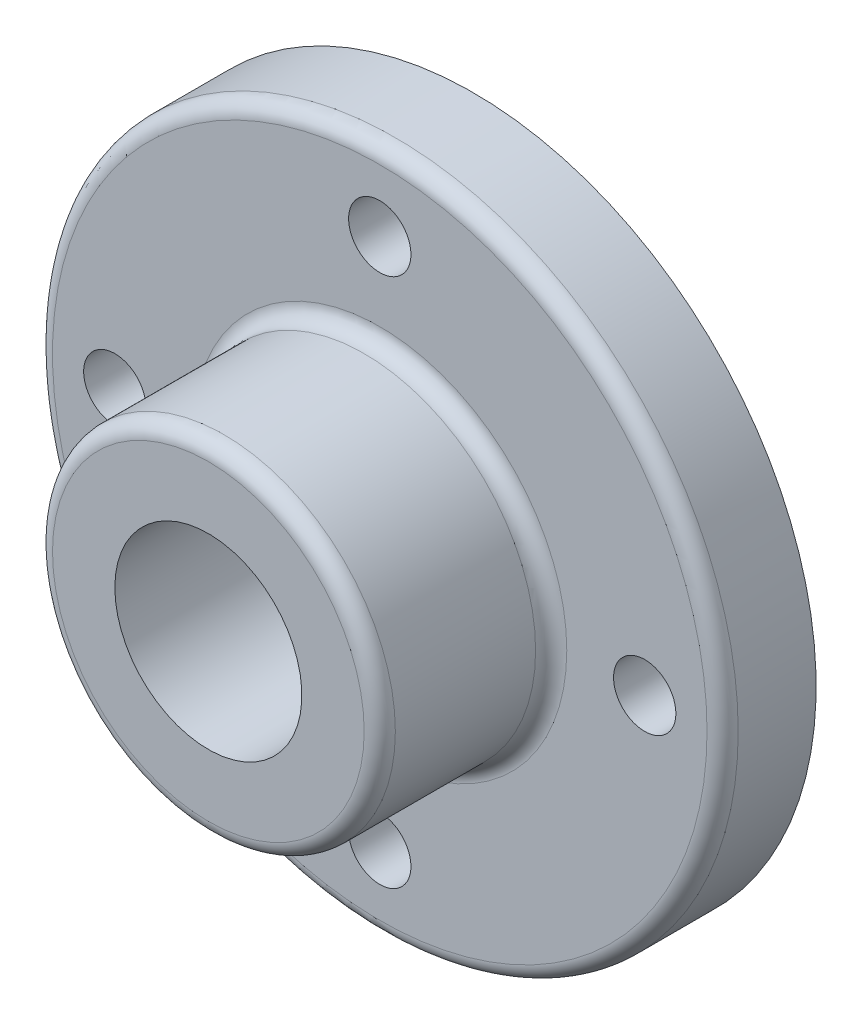
ISO-10303-21;
HEADER;
FILE_DESCRIPTION(('STEP AP214'),'2;1');
FILE_NAME('part.step','',(''),(''),'','','');
FILE_SCHEMA(('AUTOMOTIVE_DESIGN { 1 0 10303 214 1 1 1 1 }'));
ENDSEC;
DATA;
#1=APPLICATION_CONTEXT('core data for automotive mechanical design processes');
#2=APPLICATION_PROTOCOL_DEFINITION('international standard','automotive_design',2000,#1);
#3=PRODUCT_CONTEXT('',#1,'mechanical');
#4=PRODUCT('Part','Part','',(#3));
#5=PRODUCT_RELATED_PRODUCT_CATEGORY('part','',(#4));
#6=PRODUCT_DEFINITION_FORMATION('','',#4);
#7=PRODUCT_DEFINITION_CONTEXT('part definition',#1,'design');
#8=PRODUCT_DEFINITION('design','',#6,#7);
#9=PRODUCT_DEFINITION_SHAPE('','',#8);
#10=(LENGTH_UNIT() NAMED_UNIT(*) SI_UNIT(.MILLI.,.METRE.));
#11=(NAMED_UNIT(*) PLANE_ANGLE_UNIT() SI_UNIT($,.RADIAN.));
#12=(NAMED_UNIT(*) SI_UNIT($,.STERADIAN.) SOLID_ANGLE_UNIT());
#13=UNCERTAINTY_MEASURE_WITH_UNIT(LENGTH_MEASURE(1.E-05),#10,'distance_accuracy_value','');
#14=(GEOMETRIC_REPRESENTATION_CONTEXT(3) GLOBAL_UNCERTAINTY_ASSIGNED_CONTEXT((#13)) GLOBAL_UNIT_ASSIGNED_CONTEXT((#10,
#11,#12)) REPRESENTATION_CONTEXT('',''));
#15=CARTESIAN_POINT('',(0.,0.,0.));
#16=DIRECTION('',(0.,0.,1.));
#17=DIRECTION('',(1.,0.,0.));
#18=AXIS2_PLACEMENT_3D('',#15,#16,#17);
#19=CARTESIAN_POINT('',(0.,0.,48.3194698526859));
#20=DIRECTION('',(0.,0.,-1.));
#21=DIRECTION('',(-1.,0.,0.));
#22=AXIS2_PLACEMENT_3D('',#19,#20,#21);
#23=CYLINDRICAL_SURFACE('',#22,19.05);
#24=CARTESIAN_POINT('',(0.,0.,0.));
#25=DIRECTION('',(0.,0.,-1.));
#26=DIRECTION('',(-1.,0.,0.));
#27=AXIS2_PLACEMENT_3D('',#24,#25,#26);
#28=CIRCLE('',#27,19.05);
#29=CARTESIAN_POINT('',(-19.05,0.,0.));
#30=VERTEX_POINT('',#29);
#31=EDGE_CURVE('E56',#30,#30,#28,.T.);
#32=ORIENTED_EDGE('',*,*,#31,.T.);
#33=EDGE_LOOP('',(#32));
#34=FACE_BOUND('',#33,.T.);
#35=CARTESIAN_POINT('',(0.,0.,53.975));
#36=DIRECTION('',(0.,0.,-1.));
#37=DIRECTION('',(-1.,0.,0.));
#38=AXIS2_PLACEMENT_3D('',#35,#36,#37);
#39=CIRCLE('',#38,19.05);
#40=CARTESIAN_POINT('',(-19.05,0.,53.975));
#41=VERTEX_POINT('',#40);
#42=EDGE_CURVE('E62',#41,#41,#39,.T.);
#43=ORIENTED_EDGE('',*,*,#42,.F.);
#44=EDGE_LOOP('',(#43));
#45=FACE_BOUND('',#44,.T.);
#46=ADVANCED_FACE('F30',(#34,#45),#23,.F.);
#47=CARTESIAN_POINT('',(0.,19.05,0.));
#48=DIRECTION('',(0.,0.,-1.));
#49=DIRECTION('',(-1.,0.,0.));
#50=AXIS2_PLACEMENT_3D('',#47,#48,#49);
#51=PLANE('',#50);
#52=CARTESIAN_POINT('',(53.975,5.65358115792174E-13,0.));
#53=DIRECTION('',(0.,0.,1.));
#54=DIRECTION('',(1.,0.,0.));
#55=AXIS2_PLACEMENT_3D('',#52,#53,#54);
#56=CIRCLE('',#55,6.34999999999999);
#57=CARTESIAN_POINT('',(60.325,5.65358115792174E-13,0.));
#58=VERTEX_POINT('',#57);
#59=EDGE_CURVE('E86',#58,#58,#56,.T.);
#60=ORIENTED_EDGE('',*,*,#59,.T.);
#61=EDGE_LOOP('',(#60));
#62=FACE_BOUND('',#61,.T.);
#63=CARTESIAN_POINT('',(3.76905410528116E-13,-53.975,0.));
#64=DIRECTION('',(0.,0.,1.));
#65=DIRECTION('',(1.,0.,0.));
#66=AXIS2_PLACEMENT_3D('',#63,#64,#65);
#67=CIRCLE('',#66,6.34999999999999);
#68=CARTESIAN_POINT('',(6.35000000000037,-53.975,0.));
#69=VERTEX_POINT('',#68);
#70=EDGE_CURVE('E80',#69,#69,#67,.T.);
#71=ORIENTED_EDGE('',*,*,#70,.T.);
#72=EDGE_LOOP('',(#71));
#73=FACE_BOUND('',#72,.T.);
#74=CARTESIAN_POINT('',(-53.975,-1.88452705264058E-13,0.));
#75=DIRECTION('',(0.,0.,1.));
#76=DIRECTION('',(1.,0.,0.));
#77=AXIS2_PLACEMENT_3D('',#74,#75,#76);
#78=CIRCLE('',#77,6.34999999999999);
#79=CARTESIAN_POINT('',(-47.625,-1.88452705264058E-13,0.));
#80=VERTEX_POINT('',#79);
#81=EDGE_CURVE('E74',#80,#80,#78,.T.);
#82=ORIENTED_EDGE('',*,*,#81,.T.);
#83=EDGE_LOOP('',(#82));
#84=FACE_BOUND('',#83,.T.);
#85=CARTESIAN_POINT('',(0.,53.975,0.));
#86=DIRECTION('',(0.,0.,1.));
#87=DIRECTION('',(1.,0.,0.));
#88=AXIS2_PLACEMENT_3D('',#85,#86,#87);
#89=CIRCLE('',#88,6.34999999999999);
#90=CARTESIAN_POINT('',(6.34999999999999,53.975,0.));
#91=VERTEX_POINT('',#90);
#92=EDGE_CURVE('E68',#91,#91,#89,.T.);
#93=ORIENTED_EDGE('',*,*,#92,.T.);
#94=EDGE_LOOP('',(#93));
#95=FACE_BOUND('',#94,.T.);
#96=CARTESIAN_POINT('',(0.,0.,0.));
#97=DIRECTION('',(0.,0.,-1.));
#98=DIRECTION('',(-1.,0.,0.));
#99=AXIS2_PLACEMENT_3D('',#96,#97,#98);
#100=CIRCLE('',#99,69.85);
#101=CARTESIAN_POINT('',(-69.85,0.,0.));
#102=VERTEX_POINT('',#101);
#103=EDGE_CURVE('E59',#102,#102,#100,.T.);
#104=ORIENTED_EDGE('',*,*,#103,.T.);
#105=EDGE_LOOP('',(#104));
#106=FACE_BOUND('',#105,.T.);
#107=ORIENTED_EDGE('',*,*,#31,.F.);
#108=EDGE_LOOP('',(#107));
#109=FACE_BOUND('',#108,.T.);
#110=ADVANCED_FACE('F90',(#62,#73,#84,#95,#106,#109),#51,.T.);
#111=CARTESIAN_POINT('',(0.,0.,48.3194698526859));
#112=DIRECTION('',(0.,0.,-1.));
#113=DIRECTION('',(-1.,0.,0.));
#114=AXIS2_PLACEMENT_3D('',#111,#112,#113);
#115=CYLINDRICAL_SURFACE('',#114,69.85);
#116=CARTESIAN_POINT('',(0.,0.,15.875));
#117=DIRECTION('',(0.,0.,1.));
#118=DIRECTION('',(1.,0.,0.));
#119=AXIS2_PLACEMENT_3D('',#116,#117,#118);
#120=CIRCLE('',#119,69.85);
#121=CARTESIAN_POINT('',(69.85,0.,15.875));
#122=VERTEX_POINT('',#121);
#123=EDGE_CURVE('E10',#122,#122,#120,.F.);
#124=ORIENTED_EDGE('',*,*,#123,.T.);
#125=EDGE_LOOP('',(#124));
#126=FACE_BOUND('',#125,.T.);
#127=ORIENTED_EDGE('',*,*,#103,.F.);
#128=EDGE_LOOP('',(#127));
#129=FACE_BOUND('',#128,.T.);
#130=ADVANCED_FACE('F105',(#126,#129),#115,.T.);
#131=CARTESIAN_POINT('',(0.,69.85,19.05));
#132=DIRECTION('',(0.,0.,1.));
#133=DIRECTION('',(1.,0.,0.));
#134=AXIS2_PLACEMENT_3D('',#131,#132,#133);
#135=PLANE('',#134);
#136=CARTESIAN_POINT('',(0.,0.,19.05));
#137=DIRECTION('',(0.,0.,1.));
#138=DIRECTION('',(1.,0.,0.));
#139=AXIS2_PLACEMENT_3D('',#136,#137,#138);
#140=CIRCLE('',#139,38.1);
#141=CARTESIAN_POINT('',(38.1,0.,19.05));
#142=VERTEX_POINT('',#141);
#143=EDGE_CURVE('E37',#142,#142,#140,.F.);
#144=ORIENTED_EDGE('',*,*,#143,.T.);
#145=EDGE_LOOP('',(#144));
#146=FACE_BOUND('',#145,.T.);
#147=CARTESIAN_POINT('',(0.,0.,19.05));
#148=DIRECTION('',(0.,0.,1.));
#149=DIRECTION('',(1.,0.,0.));
#150=AXIS2_PLACEMENT_3D('',#147,#148,#149);
#151=CIRCLE('',#150,66.675);
#152=CARTESIAN_POINT('',(66.675,0.,19.05));
#153=VERTEX_POINT('',#152);
#154=EDGE_CURVE('E41',#153,#153,#151,.T.);
#155=ORIENTED_EDGE('',*,*,#154,.T.);
#156=EDGE_LOOP('',(#155));
#157=FACE_BOUND('',#156,.T.);
#158=CARTESIAN_POINT('',(53.975,5.65358115792174E-13,19.05));
#159=DIRECTION('',(0.,0.,1.));
#160=DIRECTION('',(1.,0.,0.));
#161=AXIS2_PLACEMENT_3D('',#158,#159,#160);
#162=CIRCLE('',#161,6.34999999999999);
#163=CARTESIAN_POINT('',(60.325,5.65358115792174E-13,19.05));
#164=VERTEX_POINT('',#163);
#165=EDGE_CURVE('E83',#164,#164,#162,.T.);
#166=ORIENTED_EDGE('',*,*,#165,.F.);
#167=EDGE_LOOP('',(#166));
#168=FACE_BOUND('',#167,.T.);
#169=CARTESIAN_POINT('',(3.76905410528116E-13,-53.975,19.05));
#170=DIRECTION('',(0.,0.,1.));
#171=DIRECTION('',(1.,0.,0.));
#172=AXIS2_PLACEMENT_3D('',#169,#170,#171);
#173=CIRCLE('',#172,6.34999999999999);
#174=CARTESIAN_POINT('',(6.35000000000036,-53.975,19.05));
#175=VERTEX_POINT('',#174);
#176=EDGE_CURVE('E77',#175,#175,#173,.T.);
#177=ORIENTED_EDGE('',*,*,#176,.F.);
#178=EDGE_LOOP('',(#177));
#179=FACE_BOUND('',#178,.T.);
#180=CARTESIAN_POINT('',(-53.975,-1.88452705264058E-13,19.05));
#181=DIRECTION('',(0.,0.,1.));
#182=DIRECTION('',(1.,0.,0.));
#183=AXIS2_PLACEMENT_3D('',#180,#181,#182);
#184=CIRCLE('',#183,6.34999999999999);
#185=CARTESIAN_POINT('',(-47.625,-1.88452705264058E-13,19.05));
#186=VERTEX_POINT('',#185);
#187=EDGE_CURVE('E71',#186,#186,#184,.T.);
#188=ORIENTED_EDGE('',*,*,#187,.F.);
#189=EDGE_LOOP('',(#188));
#190=FACE_BOUND('',#189,.T.);
#191=CARTESIAN_POINT('',(0.,53.975,19.05));
#192=DIRECTION('',(0.,0.,1.));
#193=DIRECTION('',(1.,0.,0.));
#194=AXIS2_PLACEMENT_3D('',#191,#192,#193);
#195=CIRCLE('',#194,6.34999999999999);
#196=CARTESIAN_POINT('',(6.34999999999999,53.975,19.05));
#197=VERTEX_POINT('',#196);
#198=EDGE_CURVE('E65',#197,#197,#195,.T.);
#199=ORIENTED_EDGE('',*,*,#198,.F.);
#200=EDGE_LOOP('',(#199));
#201=FACE_BOUND('',#200,.T.);
#202=ADVANCED_FACE('F101',(#146,#157,#168,#179,#190,#201),#135,.T.);
#203=CARTESIAN_POINT('',(0.,0.,48.3194698526859));
#204=DIRECTION('',(0.,0.,-1.));
#205=DIRECTION('',(-1.,0.,0.));
#206=AXIS2_PLACEMENT_3D('',#203,#204,#205);
#207=CYLINDRICAL_SURFACE('',#206,34.925);
#208=CARTESIAN_POINT('',(0.,0.,50.8));
#209=DIRECTION('',(0.,0.,1.));
#210=DIRECTION('',(1.,0.,0.));
#211=AXIS2_PLACEMENT_3D('',#208,#209,#210);
#212=CIRCLE('',#211,34.925);
#213=CARTESIAN_POINT('',(34.925,0.,50.8));
#214=VERTEX_POINT('',#213);
#215=EDGE_CURVE('E50',#214,#214,#212,.F.);
#216=ORIENTED_EDGE('',*,*,#215,.T.);
#217=EDGE_LOOP('',(#216));
#218=FACE_BOUND('',#217,.T.);
#219=CARTESIAN_POINT('',(0.,0.,22.225));
#220=DIRECTION('',(0.,0.,1.));
#221=DIRECTION('',(1.,0.,0.));
#222=AXIS2_PLACEMENT_3D('',#219,#220,#221);
#223=CIRCLE('',#222,34.925);
#224=CARTESIAN_POINT('',(34.925,0.,22.225));
#225=VERTEX_POINT('',#224);
#226=EDGE_CURVE('E53',#225,#225,#223,.T.);
#227=ORIENTED_EDGE('',*,*,#226,.T.);
#228=EDGE_LOOP('',(#227));
#229=FACE_BOUND('',#228,.T.);
#230=ADVANCED_FACE('F104',(#218,#229),#207,.T.);
#231=CARTESIAN_POINT('',(0.,34.925,53.975));
#232=DIRECTION('',(0.,0.,1.));
#233=DIRECTION('',(1.,0.,0.));
#234=AXIS2_PLACEMENT_3D('',#231,#232,#233);
#235=PLANE('',#234);
#236=CARTESIAN_POINT('',(0.,0.,53.975));
#237=DIRECTION('',(0.,0.,1.));
#238=DIRECTION('',(1.,0.,0.));
#239=AXIS2_PLACEMENT_3D('',#236,#237,#238);
#240=CIRCLE('',#239,31.75);
#241=CARTESIAN_POINT('',(31.75,0.,53.975));
#242=VERTEX_POINT('',#241);
#243=EDGE_CURVE('E45',#242,#242,#240,.T.);
#244=ORIENTED_EDGE('',*,*,#243,.T.);
#245=EDGE_LOOP('',(#244));
#246=FACE_BOUND('',#245,.T.);
#247=ORIENTED_EDGE('',*,*,#42,.T.);
#248=EDGE_LOOP('',(#247));
#249=FACE_BOUND('',#248,.T.);
#250=ADVANCED_FACE('F116',(#246,#249),#235,.T.);
#251=CARTESIAN_POINT('',(0.,53.975,19.05));
#252=DIRECTION('',(0.,0.,1.));
#253=DIRECTION('',(1.,0.,0.));
#254=AXIS2_PLACEMENT_3D('',#251,#252,#253);
#255=CYLINDRICAL_SURFACE('',#254,6.34999999999999);
#256=ORIENTED_EDGE('',*,*,#92,.F.);
#257=EDGE_LOOP('',(#256));
#258=FACE_BOUND('',#257,.T.);
#259=ORIENTED_EDGE('',*,*,#198,.T.);
#260=EDGE_LOOP('',(#259));
#261=FACE_BOUND('',#260,.T.);
#262=ADVANCED_FACE('F113',(#258,#261),#255,.F.);
#263=CARTESIAN_POINT('',(-53.975,-1.88452705264058E-13,19.05));
#264=DIRECTION('',(0.,0.,1.));
#265=DIRECTION('',(1.,0.,0.));
#266=AXIS2_PLACEMENT_3D('',#263,#264,#265);
#267=CYLINDRICAL_SURFACE('',#266,6.34999999999999);
#268=ORIENTED_EDGE('',*,*,#81,.F.);
#269=EDGE_LOOP('',(#268));
#270=FACE_BOUND('',#269,.T.);
#271=ORIENTED_EDGE('',*,*,#187,.T.);
#272=EDGE_LOOP('',(#271));
#273=FACE_BOUND('',#272,.T.);
#274=ADVANCED_FACE('F115',(#270,#273),#267,.F.);
#275=CARTESIAN_POINT('',(3.76905410528116E-13,-53.975,19.05));
#276=DIRECTION('',(0.,0.,1.));
#277=DIRECTION('',(1.,0.,0.));
#278=AXIS2_PLACEMENT_3D('',#275,#276,#277);
#279=CYLINDRICAL_SURFACE('',#278,6.34999999999999);
#280=ORIENTED_EDGE('',*,*,#70,.F.);
#281=EDGE_LOOP('',(#280));
#282=FACE_BOUND('',#281,.T.);
#283=ORIENTED_EDGE('',*,*,#176,.T.);
#284=EDGE_LOOP('',(#283));
#285=FACE_BOUND('',#284,.T.);
#286=ADVANCED_FACE('F97',(#282,#285),#279,.F.);
#287=CARTESIAN_POINT('',(53.975,5.65358115792174E-13,19.05));
#288=DIRECTION('',(0.,0.,1.));
#289=DIRECTION('',(1.,0.,0.));
#290=AXIS2_PLACEMENT_3D('',#287,#288,#289);
#291=CYLINDRICAL_SURFACE('',#290,6.34999999999999);
#292=ORIENTED_EDGE('',*,*,#59,.F.);
#293=EDGE_LOOP('',(#292));
#294=FACE_BOUND('',#293,.T.);
#295=ORIENTED_EDGE('',*,*,#165,.T.);
#296=EDGE_LOOP('',(#295));
#297=FACE_BOUND('',#296,.T.);
#298=ADVANCED_FACE('F93',(#294,#297),#291,.F.);
#299=CARTESIAN_POINT('',(0.,0.,50.8));
#300=DIRECTION('',(0.,0.,1.));
#301=DIRECTION('',(1.,0.,0.));
#302=AXIS2_PLACEMENT_3D('',#299,#300,#301);
#303=TOROIDAL_SURFACE('',#302,31.75,3.175);
#304=ORIENTED_EDGE('',*,*,#243,.F.);
#305=EDGE_LOOP('',(#304));
#306=FACE_BOUND('',#305,.T.);
#307=ORIENTED_EDGE('',*,*,#215,.F.);
#308=EDGE_LOOP('',(#307));
#309=FACE_BOUND('',#308,.T.);
#310=ADVANCED_FACE('F96',(#306,#309),#303,.T.);
#311=CARTESIAN_POINT('',(0.,0.,22.225));
#312=DIRECTION('',(0.,0.,1.));
#313=DIRECTION('',(1.,0.,0.));
#314=AXIS2_PLACEMENT_3D('',#311,#312,#313);
#315=TOROIDAL_SURFACE('',#314,38.1,3.175);
#316=ORIENTED_EDGE('',*,*,#226,.F.);
#317=EDGE_LOOP('',(#316));
#318=FACE_BOUND('',#317,.T.);
#319=ORIENTED_EDGE('',*,*,#143,.F.);
#320=EDGE_LOOP('',(#319));
#321=FACE_BOUND('',#320,.T.);
#322=ADVANCED_FACE('F139',(#318,#321),#315,.F.);
#323=CARTESIAN_POINT('',(0.,0.,15.875));
#324=DIRECTION('',(0.,0.,1.));
#325=DIRECTION('',(1.,0.,0.));
#326=AXIS2_PLACEMENT_3D('',#323,#324,#325);
#327=TOROIDAL_SURFACE('',#326,66.675,3.175);
#328=ORIENTED_EDGE('',*,*,#154,.F.);
#329=EDGE_LOOP('',(#328));
#330=FACE_BOUND('',#329,.T.);
#331=ORIENTED_EDGE('',*,*,#123,.F.);
#332=EDGE_LOOP('',(#331));
#333=FACE_BOUND('',#332,.T.);
#334=ADVANCED_FACE('F32',(#330,#333),#327,.T.);
#335=CLOSED_SHELL('',(#46,#110,#130,#202,#230,#250,#262,#274,#286,#298,#310,#322,#334));
#336=MANIFOLD_SOLID_BREP('B2',#335);
#337=ADVANCED_BREP_SHAPE_REPRESENTATION('',(#18,#336),#14);
#338=SHAPE_DEFINITION_REPRESENTATION(#9,#337);
ENDSEC;
END-ISO-10303-21;
